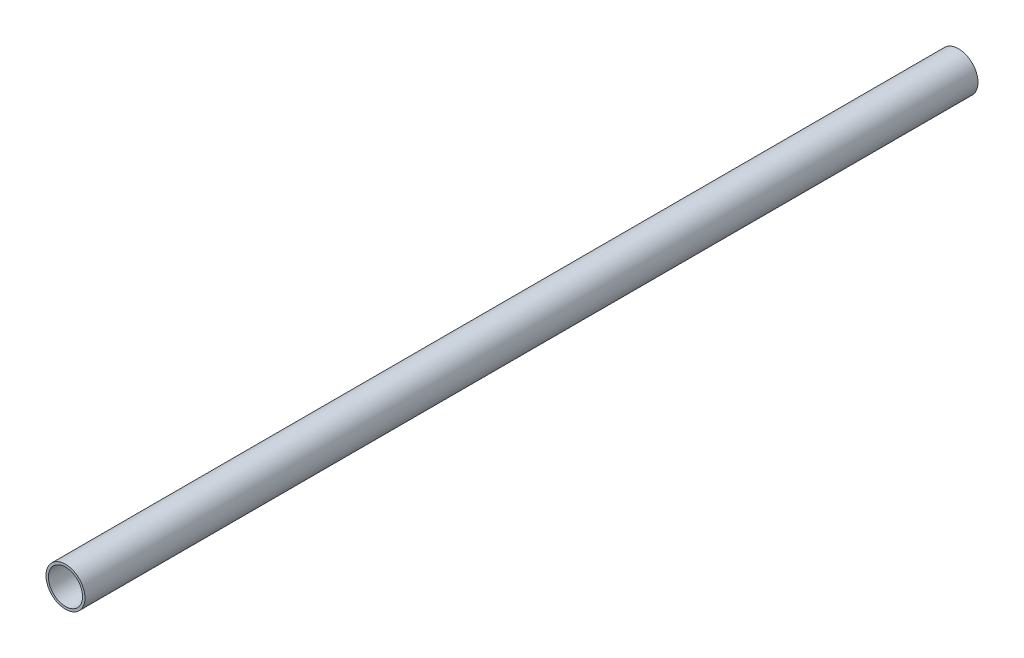
ISO-10303-21;
HEADER;
FILE_DESCRIPTION(('STEP AP214'),'2;1');
FILE_NAME('part.step','',(''),(''),'','','');
FILE_SCHEMA(('AUTOMOTIVE_DESIGN { 1 0 10303 214 1 1 1 1 }'));
ENDSEC;
DATA;
#1=APPLICATION_CONTEXT('core data for automotive mechanical design processes');
#2=APPLICATION_PROTOCOL_DEFINITION('international standard','automotive_design',2000,#1);
#3=PRODUCT_CONTEXT('',#1,'mechanical');
#4=PRODUCT('Part','Part','',(#3));
#5=PRODUCT_RELATED_PRODUCT_CATEGORY('part','',(#4));
#6=PRODUCT_DEFINITION_FORMATION('','',#4);
#7=PRODUCT_DEFINITION_CONTEXT('part definition',#1,'design');
#8=PRODUCT_DEFINITION('design','',#6,#7);
#9=PRODUCT_DEFINITION_SHAPE('','',#8);
#10=(LENGTH_UNIT() NAMED_UNIT(*) SI_UNIT(.MILLI.,.METRE.));
#11=(NAMED_UNIT(*) PLANE_ANGLE_UNIT() SI_UNIT($,.RADIAN.));
#12=(NAMED_UNIT(*) SI_UNIT($,.STERADIAN.) SOLID_ANGLE_UNIT());
#13=UNCERTAINTY_MEASURE_WITH_UNIT(LENGTH_MEASURE(1.E-05),#10,'distance_accuracy_value','');
#14=(GEOMETRIC_REPRESENTATION_CONTEXT(3) GLOBAL_UNCERTAINTY_ASSIGNED_CONTEXT((#13)) GLOBAL_UNIT_ASSIGNED_CONTEXT((#10,
#11,#12)) REPRESENTATION_CONTEXT('',''));
#15=CARTESIAN_POINT('',(0.,0.,0.));
#16=DIRECTION('',(0.,0.,1.));
#17=DIRECTION('',(1.,0.,0.));
#18=AXIS2_PLACEMENT_3D('',#15,#16,#17);
#19=CARTESIAN_POINT('',(0.,0.,290.521999981));
#20=DIRECTION('',(0.,0.,1.));
#21=DIRECTION('',(1.,0.,0.));
#22=AXIS2_PLACEMENT_3D('',#19,#20,#21);
#23=PLANE('',#22);
#24=CARTESIAN_POINT('',(0.,0.,290.521999981));
#25=DIRECTION('',(0.,0.,1.));
#26=DIRECTION('',(1.,0.,0.));
#27=AXIS2_PLACEMENT_3D('',#24,#25,#26);
#28=CIRCLE('',#27,12.7);
#29=CARTESIAN_POINT('',(12.7,0.,290.521999981));
#30=VERTEX_POINT('',#29);
#31=EDGE_CURVE('E10',#30,#30,#28,.T.);
#32=ORIENTED_EDGE('',*,*,#31,.T.);
#33=EDGE_LOOP('',(#32));
#34=FACE_BOUND('',#33,.T.);
#35=CARTESIAN_POINT('',(0.,0.,290.521999981));
#36=DIRECTION('',(0.,0.,1.));
#37=DIRECTION('',(1.,0.,0.));
#38=AXIS2_PLACEMENT_3D('',#35,#36,#37);
#39=CIRCLE('',#38,11.1125);
#40=CARTESIAN_POINT('',(11.1125,0.,290.521999981));
#41=VERTEX_POINT('',#40);
#42=EDGE_CURVE('E52',#41,#41,#39,.T.);
#43=ORIENTED_EDGE('',*,*,#42,.F.);
#44=EDGE_LOOP('',(#43));
#45=FACE_BOUND('',#44,.T.);
#46=ADVANCED_FACE('F41',(#34,#45),#23,.T.);
#47=CARTESIAN_POINT('',(0.,0.,-290.521999981));
#48=DIRECTION('',(0.,0.,1.));
#49=DIRECTION('',(1.,0.,0.));
#50=AXIS2_PLACEMENT_3D('',#47,#48,#49);
#51=PLANE('',#50);
#52=CARTESIAN_POINT('',(0.,0.,-290.521999981));
#53=DIRECTION('',(0.,0.,1.));
#54=DIRECTION('',(1.,0.,0.));
#55=AXIS2_PLACEMENT_3D('',#52,#53,#54);
#56=CIRCLE('',#55,12.7);
#57=CARTESIAN_POINT('',(12.7,0.,-290.521999981));
#58=VERTEX_POINT('',#57);
#59=EDGE_CURVE('E45',#58,#58,#56,.T.);
#60=ORIENTED_EDGE('',*,*,#59,.F.);
#61=EDGE_LOOP('',(#60));
#62=FACE_BOUND('',#61,.T.);
#63=CARTESIAN_POINT('',(0.,0.,-290.521999981));
#64=DIRECTION('',(0.,0.,1.));
#65=DIRECTION('',(1.,0.,0.));
#66=AXIS2_PLACEMENT_3D('',#63,#64,#65);
#67=CIRCLE('',#66,11.1125);
#68=CARTESIAN_POINT('',(11.1125,0.,-290.521999981));
#69=VERTEX_POINT('',#68);
#70=EDGE_CURVE('E54',#69,#69,#67,.T.);
#71=ORIENTED_EDGE('',*,*,#70,.T.);
#72=EDGE_LOOP('',(#71));
#73=FACE_BOUND('',#72,.T.);
#74=ADVANCED_FACE('F64',(#62,#73),#51,.F.);
#75=CARTESIAN_POINT('',(0.,0.,290.521999981));
#76=DIRECTION('',(0.,0.,-1.));
#77=DIRECTION('',(-1.,0.,0.));
#78=AXIS2_PLACEMENT_3D('',#75,#76,#77);
#79=CYLINDRICAL_SURFACE('',#78,12.7);
#80=ORIENTED_EDGE('',*,*,#31,.F.);
#81=EDGE_LOOP('',(#80));
#82=FACE_BOUND('',#81,.T.);
#83=ORIENTED_EDGE('',*,*,#59,.T.);
#84=EDGE_LOOP('',(#83));
#85=FACE_BOUND('',#84,.T.);
#86=ADVANCED_FACE('F43',(#82,#85),#79,.T.);
#87=CARTESIAN_POINT('',(0.,0.,290.521999981));
#88=DIRECTION('',(0.,0.,-1.));
#89=DIRECTION('',(-1.,0.,0.));
#90=AXIS2_PLACEMENT_3D('',#87,#88,#89);
#91=CYLINDRICAL_SURFACE('',#90,11.1125);
#92=ORIENTED_EDGE('',*,*,#42,.T.);
#93=EDGE_LOOP('',(#92));
#94=FACE_BOUND('',#93,.T.);
#95=ORIENTED_EDGE('',*,*,#70,.F.);
#96=EDGE_LOOP('',(#95));
#97=FACE_BOUND('',#96,.T.);
#98=ADVANCED_FACE('F60',(#94,#97),#91,.F.);
#99=CLOSED_SHELL('',(#46,#74,#86,#98));
#100=MANIFOLD_SOLID_BREP('B2',#99);
#101=ADVANCED_BREP_SHAPE_REPRESENTATION('',(#18,#100),#14);
#102=SHAPE_DEFINITION_REPRESENTATION(#9,#101);
ENDSEC;
END-ISO-10303-21;
